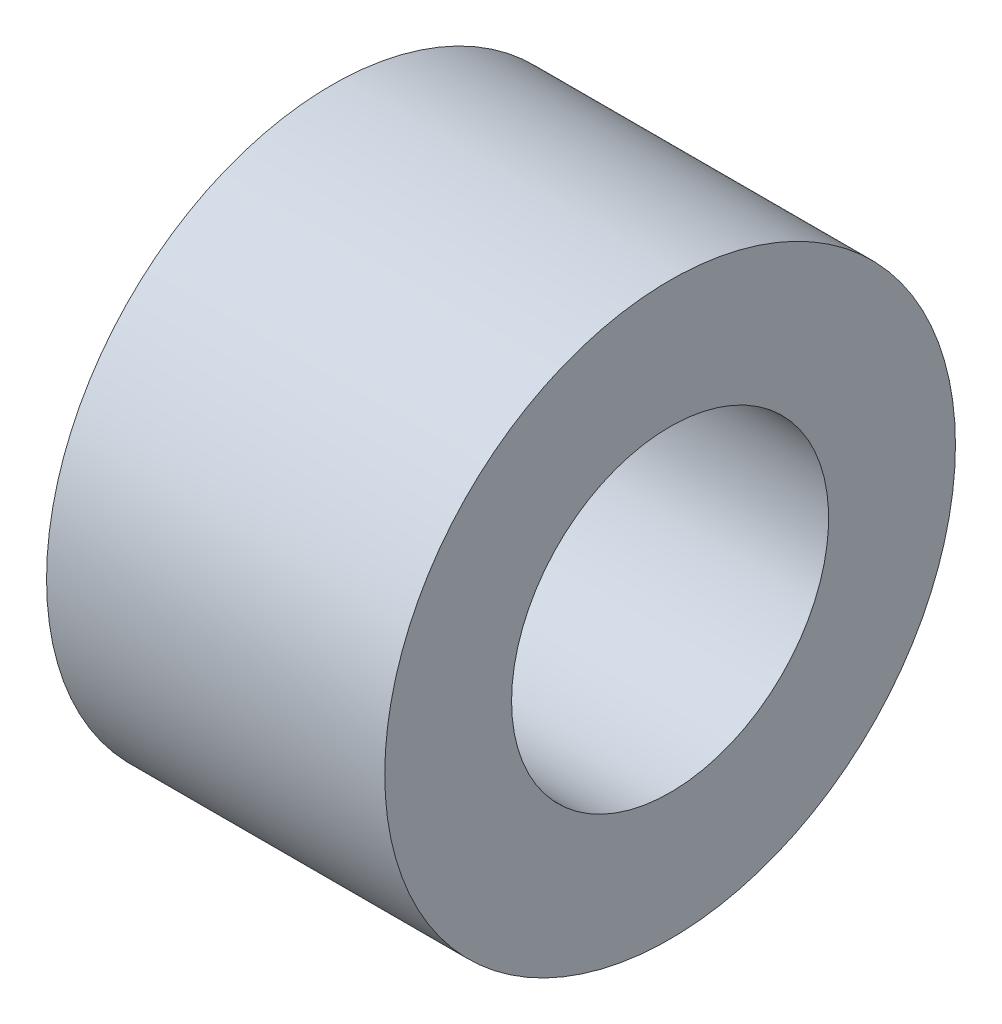
ISO-10303-21;
HEADER;
FILE_DESCRIPTION(('STEP AP214'),'2;1');
FILE_NAME('part.step','',(''),(''),'','','');
FILE_SCHEMA(('AUTOMOTIVE_DESIGN { 1 0 10303 214 1 1 1 1 }'));
ENDSEC;
DATA;
#1=APPLICATION_CONTEXT('core data for automotive mechanical design processes');
#2=APPLICATION_PROTOCOL_DEFINITION('international standard','automotive_design',2000,#1);
#3=PRODUCT_CONTEXT('',#1,'mechanical');
#4=PRODUCT('Part','Part','',(#3));
#5=PRODUCT_RELATED_PRODUCT_CATEGORY('part','',(#4));
#6=PRODUCT_DEFINITION_FORMATION('','',#4);
#7=PRODUCT_DEFINITION_CONTEXT('part definition',#1,'design');
#8=PRODUCT_DEFINITION('design','',#6,#7);
#9=PRODUCT_DEFINITION_SHAPE('','',#8);
#10=(LENGTH_UNIT() NAMED_UNIT(*) SI_UNIT(.MILLI.,.METRE.));
#11=(NAMED_UNIT(*) PLANE_ANGLE_UNIT() SI_UNIT($,.RADIAN.));
#12=(NAMED_UNIT(*) SI_UNIT($,.STERADIAN.) SOLID_ANGLE_UNIT());
#13=UNCERTAINTY_MEASURE_WITH_UNIT(LENGTH_MEASURE(1.E-05),#10,'distance_accuracy_value','');
#14=(GEOMETRIC_REPRESENTATION_CONTEXT(3) GLOBAL_UNCERTAINTY_ASSIGNED_CONTEXT((#13)) GLOBAL_UNIT_ASSIGNED_CONTEXT((#10,
#11,#12)) REPRESENTATION_CONTEXT('',''));
#15=CARTESIAN_POINT('',(0.,0.,0.));
#16=DIRECTION('',(0.,0.,1.));
#17=DIRECTION('',(1.,0.,0.));
#18=AXIS2_PLACEMENT_3D('',#15,#16,#17);
#19=CARTESIAN_POINT('',(80.,37.5,0.));
#20=DIRECTION('',(-1.,0.,0.));
#21=DIRECTION('',(0.,0.,1.));
#22=AXIS2_PLACEMENT_3D('',#19,#20,#21);
#23=PLANE('',#22);
#24=CARTESIAN_POINT('',(80.,0.,0.));
#25=DIRECTION('',(-1.,0.,0.));
#26=DIRECTION('',(0.,0.,1.));
#27=AXIS2_PLACEMENT_3D('',#24,#25,#26);
#28=CIRCLE('',#27,67.5);
#29=CARTESIAN_POINT('',(80.,0.,67.5));
#30=VERTEX_POINT('',#29);
#31=EDGE_CURVE('E53',#30,#30,#28,.T.);
#32=ORIENTED_EDGE('',*,*,#31,.F.);
#33=EDGE_LOOP('',(#32));
#34=FACE_BOUND('',#33,.T.);
#35=CARTESIAN_POINT('',(80.,0.,0.));
#36=DIRECTION('',(-1.,0.,0.));
#37=DIRECTION('',(0.,0.,1.));
#38=AXIS2_PLACEMENT_3D('',#35,#36,#37);
#39=CIRCLE('',#38,37.5);
#40=CARTESIAN_POINT('',(80.,0.,37.5));
#41=VERTEX_POINT('',#40);
#42=EDGE_CURVE('E10',#41,#41,#39,.T.);
#43=ORIENTED_EDGE('',*,*,#42,.T.);
#44=EDGE_LOOP('',(#43));
#45=FACE_BOUND('',#44,.T.);
#46=ADVANCED_FACE('F39',(#34,#45),#23,.F.);
#47=CARTESIAN_POINT('',(0.,0.,0.));
#48=DIRECTION('',(-1.,0.,0.));
#49=DIRECTION('',(0.,0.,1.));
#50=AXIS2_PLACEMENT_3D('',#47,#48,#49);
#51=CYLINDRICAL_SURFACE('',#50,37.5);
#52=ORIENTED_EDGE('',*,*,#42,.F.);
#53=EDGE_LOOP('',(#52));
#54=FACE_BOUND('',#53,.T.);
#55=CARTESIAN_POINT('',(0.,0.,0.));
#56=DIRECTION('',(-1.,0.,0.));
#57=DIRECTION('',(0.,0.,1.));
#58=AXIS2_PLACEMENT_3D('',#55,#56,#57);
#59=CIRCLE('',#58,37.5);
#60=CARTESIAN_POINT('',(0.,0.,37.5));
#61=VERTEX_POINT('',#60);
#62=EDGE_CURVE('E45',#61,#61,#59,.T.);
#63=ORIENTED_EDGE('',*,*,#62,.T.);
#64=EDGE_LOOP('',(#63));
#65=FACE_BOUND('',#64,.T.);
#66=ADVANCED_FACE('F62',(#54,#65),#51,.F.);
#67=CARTESIAN_POINT('',(0.,37.5,0.));
#68=DIRECTION('',(1.,0.,0.));
#69=DIRECTION('',(0.,0.,-1.));
#70=AXIS2_PLACEMENT_3D('',#67,#68,#69);
#71=PLANE('',#70);
#72=ORIENTED_EDGE('',*,*,#62,.F.);
#73=EDGE_LOOP('',(#72));
#74=FACE_BOUND('',#73,.T.);
#75=CARTESIAN_POINT('',(0.,0.,0.));
#76=DIRECTION('',(-1.,0.,0.));
#77=DIRECTION('',(0.,0.,1.));
#78=AXIS2_PLACEMENT_3D('',#75,#76,#77);
#79=CIRCLE('',#78,67.5);
#80=CARTESIAN_POINT('',(0.,0.,67.5));
#81=VERTEX_POINT('',#80);
#82=EDGE_CURVE('E49',#81,#81,#79,.T.);
#83=ORIENTED_EDGE('',*,*,#82,.T.);
#84=EDGE_LOOP('',(#83));
#85=FACE_BOUND('',#84,.T.);
#86=ADVANCED_FACE('F66',(#74,#85),#71,.F.);
#87=CARTESIAN_POINT('',(0.,0.,0.));
#88=DIRECTION('',(-1.,0.,0.));
#89=DIRECTION('',(0.,0.,1.));
#90=AXIS2_PLACEMENT_3D('',#87,#88,#89);
#91=CYLINDRICAL_SURFACE('',#90,67.5);
#92=ORIENTED_EDGE('',*,*,#82,.F.);
#93=EDGE_LOOP('',(#92));
#94=FACE_BOUND('',#93,.T.);
#95=ORIENTED_EDGE('',*,*,#31,.T.);
#96=EDGE_LOOP('',(#95));
#97=FACE_BOUND('',#96,.T.);
#98=ADVANCED_FACE('F59',(#94,#97),#91,.T.);
#99=CLOSED_SHELL('',(#46,#66,#86,#98));
#100=MANIFOLD_SOLID_BREP('B2',#99);
#101=ADVANCED_BREP_SHAPE_REPRESENTATION('',(#18,#100),#14);
#102=SHAPE_DEFINITION_REPRESENTATION(#9,#101);
ENDSEC;
END-ISO-10303-21;
